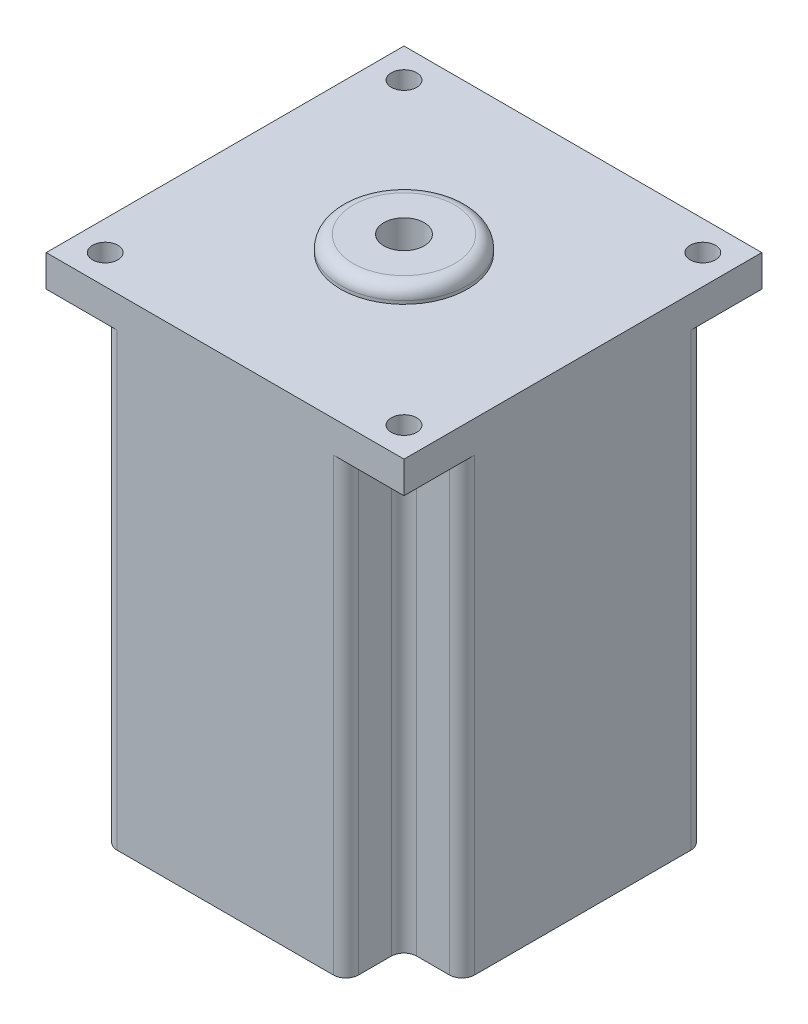
ISO-10303-21;
HEADER;
FILE_DESCRIPTION(('STEP AP214'),'2;1');
FILE_NAME('part.step','',(''),(''),'','','');
FILE_SCHEMA(('AUTOMOTIVE_DESIGN { 1 0 10303 214 1 1 1 1 }'));
ENDSEC;
DATA;
#1=APPLICATION_CONTEXT('core data for automotive mechanical design processes');
#2=APPLICATION_PROTOCOL_DEFINITION('international standard','automotive_design',2000,#1);
#3=PRODUCT_CONTEXT('',#1,'mechanical');
#4=PRODUCT('Part','Part','',(#3));
#5=PRODUCT_RELATED_PRODUCT_CATEGORY('part','',(#4));
#6=PRODUCT_DEFINITION_FORMATION('','',#4);
#7=PRODUCT_DEFINITION_CONTEXT('part definition',#1,'design');
#8=PRODUCT_DEFINITION('design','',#6,#7);
#9=PRODUCT_DEFINITION_SHAPE('','',#8);
#10=(LENGTH_UNIT() NAMED_UNIT(*) SI_UNIT(.MILLI.,.METRE.));
#11=(NAMED_UNIT(*) PLANE_ANGLE_UNIT() SI_UNIT($,.RADIAN.));
#12=(NAMED_UNIT(*) SI_UNIT($,.STERADIAN.) SOLID_ANGLE_UNIT());
#13=UNCERTAINTY_MEASURE_WITH_UNIT(LENGTH_MEASURE(1.E-05),#10,'distance_accuracy_value','');
#14=(GEOMETRIC_REPRESENTATION_CONTEXT(3) GLOBAL_UNCERTAINTY_ASSIGNED_CONTEXT((#13)) GLOBAL_UNIT_ASSIGNED_CONTEXT((#10,
#11,#12)) REPRESENTATION_CONTEXT('',''));
#15=CARTESIAN_POINT('',(0.,0.,0.));
#16=DIRECTION('',(0.,0.,1.));
#17=DIRECTION('',(1.,0.,0.));
#18=AXIS2_PLACEMENT_3D('',#15,#16,#17);
#19=CARTESIAN_POINT('',(0.,76.,0.));
#20=DIRECTION('',(0.,1.,0.));
#21=DIRECTION('',(0.,0.,1.));
#22=AXIS2_PLACEMENT_3D('',#19,#20,#21);
#23=PLANE('',#22);
#24=DIRECTION('',(0.,0.,-1.));
#25=VECTOR('',#24,1.);
#26=CARTESIAN_POINT('',(28.2,76.,-28.2));
#27=LINE('',#26,#25);
#28=CARTESIAN_POINT('',(28.2,76.,28.2));
#29=VERTEX_POINT('',#28);
#30=CARTESIAN_POINT('',(28.2,76.,-28.2));
#31=VERTEX_POINT('',#30);
#32=EDGE_CURVE('E367',#29,#31,#27,.T.);
#33=ORIENTED_EDGE('',*,*,#32,.T.);
#34=DIRECTION('',(-1.,0.,0.));
#35=VECTOR('',#34,1.);
#36=CARTESIAN_POINT('',(-28.2,76.,-28.2));
#37=LINE('',#36,#35);
#38=CARTESIAN_POINT('',(-28.2,76.,-28.2));
#39=VERTEX_POINT('',#38);
#40=EDGE_CURVE('E370',#31,#39,#37,.T.);
#41=ORIENTED_EDGE('',*,*,#40,.T.);
#42=DIRECTION('',(0.,0.,1.));
#43=VECTOR('',#42,1.);
#44=CARTESIAN_POINT('',(-28.2,76.,-28.2));
#45=LINE('',#44,#43);
#46=CARTESIAN_POINT('',(-28.2,76.,28.2));
#47=VERTEX_POINT('',#46);
#48=EDGE_CURVE('E373',#39,#47,#45,.T.);
#49=ORIENTED_EDGE('',*,*,#48,.T.);
#50=DIRECTION('',(1.,0.,0.));
#51=VECTOR('',#50,1.);
#52=CARTESIAN_POINT('',(-28.2,76.,28.2));
#53=LINE('',#52,#51);
#54=EDGE_CURVE('E375',#47,#29,#53,.T.);
#55=ORIENTED_EDGE('',*,*,#54,.T.);
#56=EDGE_LOOP('',(#33,#41,#49,#55));
#57=FACE_BOUND('',#56,.T.);
#58=CARTESIAN_POINT('',(-23.55,76.,-23.55));
#59=DIRECTION('',(0.,1.,0.));
#60=DIRECTION('',(0.,0.,1.));
#61=AXIS2_PLACEMENT_3D('',#58,#59,#60);
#62=CIRCLE('',#61,2.);
#63=CARTESIAN_POINT('',(-23.55,76.,-21.55));
#64=VERTEX_POINT('',#63);
#65=EDGE_CURVE('E355',#64,#64,#62,.T.);
#66=ORIENTED_EDGE('',*,*,#65,.F.);
#67=EDGE_LOOP('',(#66));
#68=FACE_BOUND('',#67,.T.);
#69=CARTESIAN_POINT('',(23.55,76.,-23.55));
#70=DIRECTION('',(0.,1.,0.));
#71=DIRECTION('',(0.,0.,1.));
#72=AXIS2_PLACEMENT_3D('',#69,#70,#71);
#73=CIRCLE('',#72,2.);
#74=CARTESIAN_POINT('',(23.55,76.,-21.55));
#75=VERTEX_POINT('',#74);
#76=EDGE_CURVE('E352',#75,#75,#73,.T.);
#77=ORIENTED_EDGE('',*,*,#76,.F.);
#78=EDGE_LOOP('',(#77));
#79=FACE_BOUND('',#78,.T.);
#80=CARTESIAN_POINT('',(-23.55,76.,23.55));
#81=DIRECTION('',(0.,1.,0.));
#82=DIRECTION('',(0.,0.,1.));
#83=AXIS2_PLACEMENT_3D('',#80,#81,#82);
#84=CIRCLE('',#83,2.);
#85=CARTESIAN_POINT('',(-23.55,76.,25.55));
#86=VERTEX_POINT('',#85);
#87=EDGE_CURVE('E359',#86,#86,#84,.T.);
#88=ORIENTED_EDGE('',*,*,#87,.F.);
#89=EDGE_LOOP('',(#88));
#90=FACE_BOUND('',#89,.T.);
#91=CARTESIAN_POINT('',(23.55,76.,23.55));
#92=DIRECTION('',(0.,1.,0.));
#93=DIRECTION('',(0.,0.,1.));
#94=AXIS2_PLACEMENT_3D('',#91,#92,#93);
#95=CIRCLE('',#94,2.);
#96=CARTESIAN_POINT('',(23.55,76.,25.55));
#97=VERTEX_POINT('',#96);
#98=EDGE_CURVE('E349',#97,#97,#95,.T.);
#99=ORIENTED_EDGE('',*,*,#98,.F.);
#100=EDGE_LOOP('',(#99));
#101=FACE_BOUND('',#100,.T.);
#102=CARTESIAN_POINT('',(0.,76.,0.));
#103=DIRECTION('',(0.,1.,0.));
#104=DIRECTION('',(0.,0.,1.));
#105=AXIS2_PLACEMENT_3D('',#102,#103,#104);
#106=CIRCLE('',#105,10.);
#107=CARTESIAN_POINT('',(0.,76.,10.));
#108=VERTEX_POINT('',#107);
#109=EDGE_CURVE('E315',#108,#108,#106,.T.);
#110=ORIENTED_EDGE('',*,*,#109,.F.);
#111=EDGE_LOOP('',(#110));
#112=FACE_BOUND('',#111,.T.);
#113=ADVANCED_FACE('F33',(#57,#68,#79,#90,#101,#112),#23,.T.);
#114=CARTESIAN_POINT('',(-28.2,76.,-28.2));
#115=DIRECTION('',(0.,0.,1.));
#116=DIRECTION('',(1.,0.,0.));
#117=AXIS2_PLACEMENT_3D('',#114,#115,#116);
#118=PLANE('',#117);
#119=DIRECTION('',(-1.,0.,0.));
#120=VECTOR('',#119,1.);
#121=CARTESIAN_POINT('',(-28.2,0.,-28.2));
#122=LINE('',#121,#120);
#123=CARTESIAN_POINT('',(17.05,0.,-28.2));
#124=VERTEX_POINT('',#123);
#125=CARTESIAN_POINT('',(-17.05,0.,-28.2));
#126=VERTEX_POINT('',#125);
#127=EDGE_CURVE('E380',#124,#126,#122,.T.);
#128=ORIENTED_EDGE('',*,*,#127,.T.);
#129=DIRECTION('',(0.,-1.,0.));
#130=VECTOR('',#129,1.);
#131=CARTESIAN_POINT('',(-17.05,71.,-28.2));
#132=LINE('',#131,#130);
#133=CARTESIAN_POINT('',(-17.05,71.,-28.2));
#134=VERTEX_POINT('',#133);
#135=EDGE_CURVE('E429',#126,#134,#132,.F.);
#136=ORIENTED_EDGE('',*,*,#135,.T.);
#137=DIRECTION('',(1.,0.,0.));
#138=VECTOR('',#137,1.);
#139=CARTESIAN_POINT('',(0.,71.,-28.2));
#140=LINE('',#139,#138);
#141=CARTESIAN_POINT('',(-28.2,71.,-28.2));
#142=VERTEX_POINT('',#141);
#143=EDGE_CURVE('E308',#142,#134,#140,.T.);
#144=ORIENTED_EDGE('',*,*,#143,.F.);
#145=DIRECTION('',(0.,-1.,0.));
#146=VECTOR('',#145,1.);
#147=CARTESIAN_POINT('',(-28.2,76.,-28.2));
#148=LINE('',#147,#146);
#149=EDGE_CURVE('E393',#39,#142,#148,.T.);
#150=ORIENTED_EDGE('',*,*,#149,.F.);
#151=ORIENTED_EDGE('',*,*,#40,.F.);
#152=DIRECTION('',(0.,-1.,0.));
#153=VECTOR('',#152,1.);
#154=CARTESIAN_POINT('',(28.2,76.,-28.2));
#155=LINE('',#154,#153);
#156=CARTESIAN_POINT('',(28.2,71.,-28.2));
#157=VERTEX_POINT('',#156);
#158=EDGE_CURVE('E396',#31,#157,#155,.T.);
#159=ORIENTED_EDGE('',*,*,#158,.T.);
#160=DIRECTION('',(1.,0.,0.));
#161=VECTOR('',#160,1.);
#162=CARTESIAN_POINT('',(0.,71.,-28.2));
#163=LINE('',#162,#161);
#164=CARTESIAN_POINT('',(17.05,71.,-28.2));
#165=VERTEX_POINT('',#164);
#166=EDGE_CURVE('E273',#165,#157,#163,.T.);
#167=ORIENTED_EDGE('',*,*,#166,.F.);
#168=DIRECTION('',(0.,-1.,0.));
#169=VECTOR('',#168,1.);
#170=CARTESIAN_POINT('',(17.05,76.,-28.2));
#171=LINE('',#170,#169);
#172=EDGE_CURVE('E426',#165,#124,#171,.T.);
#173=ORIENTED_EDGE('',*,*,#172,.T.);
#174=EDGE_LOOP('',(#128,#136,#144,#150,#151,#159,#167,#173));
#175=FACE_BOUND('',#174,.T.);
#176=ADVANCED_FACE('F490',(#175),#118,.F.);
#177=CARTESIAN_POINT('',(-28.2,76.,-28.2));
#178=DIRECTION('',(1.,0.,0.));
#179=DIRECTION('',(0.,0.,-1.));
#180=AXIS2_PLACEMENT_3D('',#177,#178,#179);
#181=PLANE('',#180);
#182=DIRECTION('',(0.,0.,-1.));
#183=VECTOR('',#182,1.);
#184=CARTESIAN_POINT('',(-28.2,71.,0.));
#185=LINE('',#184,#183);
#186=CARTESIAN_POINT('',(-28.2,71.,-17.05));
#187=VERTEX_POINT('',#186);
#188=EDGE_CURVE('E306',#187,#142,#185,.T.);
#189=ORIENTED_EDGE('',*,*,#188,.F.);
#190=DIRECTION('',(0.,-1.,0.));
#191=VECTOR('',#190,1.);
#192=CARTESIAN_POINT('',(-28.2,0.,-17.05));
#193=LINE('',#192,#191);
#194=CARTESIAN_POINT('',(-28.2,0.,-17.05));
#195=VERTEX_POINT('',#194);
#196=EDGE_CURVE('E402',#187,#195,#193,.T.);
#197=ORIENTED_EDGE('',*,*,#196,.T.);
#198=DIRECTION('',(0.,0.,1.));
#199=VECTOR('',#198,1.);
#200=CARTESIAN_POINT('',(-28.2,0.,-28.2));
#201=LINE('',#200,#199);
#202=CARTESIAN_POINT('',(-28.2,0.,17.05));
#203=VERTEX_POINT('',#202);
#204=EDGE_CURVE('E383',#195,#203,#201,.T.);
#205=ORIENTED_EDGE('',*,*,#204,.T.);
#206=DIRECTION('',(0.,-1.,0.));
#207=VECTOR('',#206,1.);
#208=CARTESIAN_POINT('',(-28.2,71.,17.05));
#209=LINE('',#208,#207);
#210=CARTESIAN_POINT('',(-28.2,71.,17.05));
#211=VERTEX_POINT('',#210);
#212=EDGE_CURVE('E399',#203,#211,#209,.F.);
#213=ORIENTED_EDGE('',*,*,#212,.T.);
#214=DIRECTION('',(0.,0.,-1.));
#215=VECTOR('',#214,1.);
#216=CARTESIAN_POINT('',(-28.2,71.,0.));
#217=LINE('',#216,#215);
#218=CARTESIAN_POINT('',(-28.2,71.,28.2));
#219=VERTEX_POINT('',#218);
#220=EDGE_CURVE('E331',#219,#211,#217,.T.);
#221=ORIENTED_EDGE('',*,*,#220,.F.);
#222=DIRECTION('',(0.,-1.,0.));
#223=VECTOR('',#222,1.);
#224=CARTESIAN_POINT('',(-28.2,76.,28.2));
#225=LINE('',#224,#223);
#226=EDGE_CURVE('E390',#47,#219,#225,.T.);
#227=ORIENTED_EDGE('',*,*,#226,.F.);
#228=ORIENTED_EDGE('',*,*,#48,.F.);
#229=ORIENTED_EDGE('',*,*,#149,.T.);
#230=EDGE_LOOP('',(#189,#197,#205,#213,#221,#227,#228,#229));
#231=FACE_BOUND('',#230,.T.);
#232=ADVANCED_FACE('F496',(#231),#181,.F.);
#233=CARTESIAN_POINT('',(-28.2,76.,28.2));
#234=DIRECTION('',(0.,0.,-1.));
#235=DIRECTION('',(-1.,0.,0.));
#236=AXIS2_PLACEMENT_3D('',#233,#234,#235);
#237=PLANE('',#236);
#238=DIRECTION('',(-1.,0.,0.));
#239=VECTOR('',#238,1.);
#240=CARTESIAN_POINT('',(0.,71.,28.2));
#241=LINE('',#240,#239);
#242=CARTESIAN_POINT('',(-17.05,71.,28.2));
#243=VERTEX_POINT('',#242);
#244=EDGE_CURVE('E329',#243,#219,#241,.T.);
#245=ORIENTED_EDGE('',*,*,#244,.F.);
#246=DIRECTION('',(0.,-1.,0.));
#247=VECTOR('',#246,1.);
#248=CARTESIAN_POINT('',(-17.05,0.,28.2));
#249=LINE('',#248,#247);
#250=CARTESIAN_POINT('',(-17.05,0.,28.2));
#251=VERTEX_POINT('',#250);
#252=EDGE_CURVE('E438',#243,#251,#249,.T.);
#253=ORIENTED_EDGE('',*,*,#252,.T.);
#254=DIRECTION('',(1.,0.,0.));
#255=VECTOR('',#254,1.);
#256=CARTESIAN_POINT('',(-28.2,0.,28.2));
#257=LINE('',#256,#255);
#258=CARTESIAN_POINT('',(17.05,0.,28.2));
#259=VERTEX_POINT('',#258);
#260=EDGE_CURVE('E371',#251,#259,#257,.T.);
#261=ORIENTED_EDGE('',*,*,#260,.T.);
#262=DIRECTION('',(0.,-1.,0.));
#263=VECTOR('',#262,1.);
#264=CARTESIAN_POINT('',(17.05,71.,28.2));
#265=LINE('',#264,#263);
#266=CARTESIAN_POINT('',(17.05,71.,28.2));
#267=VERTEX_POINT('',#266);
#268=EDGE_CURVE('E435',#259,#267,#265,.F.);
#269=ORIENTED_EDGE('',*,*,#268,.T.);
#270=DIRECTION('',(-1.,0.,0.));
#271=VECTOR('',#270,1.);
#272=CARTESIAN_POINT('',(0.,71.,28.2));
#273=LINE('',#272,#271);
#274=CARTESIAN_POINT('',(28.2,71.,28.2));
#275=VERTEX_POINT('',#274);
#276=EDGE_CURVE('E251',#275,#267,#273,.T.);
#277=ORIENTED_EDGE('',*,*,#276,.F.);
#278=DIRECTION('',(0.,-1.,0.));
#279=VECTOR('',#278,1.);
#280=CARTESIAN_POINT('',(28.2,76.,28.2));
#281=LINE('',#280,#279);
#282=EDGE_CURVE('E377',#29,#275,#281,.T.);
#283=ORIENTED_EDGE('',*,*,#282,.F.);
#284=ORIENTED_EDGE('',*,*,#54,.F.);
#285=ORIENTED_EDGE('',*,*,#226,.T.);
#286=EDGE_LOOP('',(#245,#253,#261,#269,#277,#283,#284,#285));
#287=FACE_BOUND('',#286,.T.);
#288=ADVANCED_FACE('F507',(#287),#237,.F.);
#289=CARTESIAN_POINT('',(0.,0.,0.));
#290=DIRECTION('',(0.,1.,0.));
#291=DIRECTION('',(0.,0.,1.));
#292=AXIS2_PLACEMENT_3D('',#289,#290,#291);
#293=PLANE('',#292);
#294=CARTESIAN_POINT('',(0.,0.,0.));
#295=DIRECTION('',(0.,1.,0.));
#296=DIRECTION('',(0.,0.,1.));
#297=AXIS2_PLACEMENT_3D('',#294,#295,#296);
#298=CIRCLE('',#297,3.175);
#299=CARTESIAN_POINT('',(0.,0.,3.175));
#300=VERTEX_POINT('',#299);
#301=EDGE_CURVE('E356',#300,#300,#298,.T.);
#302=ORIENTED_EDGE('',*,*,#301,.T.);
#303=EDGE_LOOP('',(#302));
#304=FACE_BOUND('',#303,.T.);
#305=ORIENTED_EDGE('',*,*,#204,.F.);
#306=CARTESIAN_POINT('',(-26.2,0.,-17.05));
#307=DIRECTION('',(0.,1.,0.));
#308=DIRECTION('',(0.,0.,1.));
#309=AXIS2_PLACEMENT_3D('',#306,#307,#308);
#310=CIRCLE('',#309,2.);
#311=CARTESIAN_POINT('',(-26.2,0.,-19.05));
#312=VERTEX_POINT('',#311);
#313=EDGE_CURVE('E419',#195,#312,#310,.F.);
#314=ORIENTED_EDGE('',*,*,#313,.T.);
#315=DIRECTION('',(1.,0.,0.));
#316=VECTOR('',#315,1.);
#317=CARTESIAN_POINT('',(0.,0.,-19.05));
#318=LINE('',#317,#316);
#319=CARTESIAN_POINT('',(-21.05,0.,-19.05));
#320=VERTEX_POINT('',#319);
#321=EDGE_CURVE('E298',#312,#320,#318,.T.);
#322=ORIENTED_EDGE('',*,*,#321,.T.);
#323=CARTESIAN_POINT('',(-21.05,0.,-21.05));
#324=DIRECTION('',(0.,-1.,0.));
#325=DIRECTION('',(0.,0.,-1.));
#326=AXIS2_PLACEMENT_3D('',#323,#324,#325);
#327=CIRCLE('',#326,2.);
#328=CARTESIAN_POINT('',(-19.05,0.,-21.05));
#329=VERTEX_POINT('',#328);
#330=EDGE_CURVE('E314',#329,#320,#327,.T.);
#331=ORIENTED_EDGE('',*,*,#330,.F.);
#332=DIRECTION('',(0.,0.,-1.));
#333=VECTOR('',#332,1.);
#334=CARTESIAN_POINT('',(-19.05,0.,0.));
#335=LINE('',#334,#333);
#336=CARTESIAN_POINT('',(-19.05,0.,-26.2));
#337=VERTEX_POINT('',#336);
#338=EDGE_CURVE('E311',#329,#337,#335,.T.);
#339=ORIENTED_EDGE('',*,*,#338,.T.);
#340=CARTESIAN_POINT('',(-17.05,0.,-26.2));
#341=DIRECTION('',(0.,1.,0.));
#342=DIRECTION('',(0.,0.,1.));
#343=AXIS2_PLACEMENT_3D('',#340,#341,#342);
#344=CIRCLE('',#343,2.);
#345=EDGE_CURVE('E417',#337,#126,#344,.F.);
#346=ORIENTED_EDGE('',*,*,#345,.T.);
#347=ORIENTED_EDGE('',*,*,#127,.F.);
#348=CARTESIAN_POINT('',(17.05,0.,-26.2));
#349=DIRECTION('',(0.,1.,0.));
#350=DIRECTION('',(0.,0.,1.));
#351=AXIS2_PLACEMENT_3D('',#348,#349,#350);
#352=CIRCLE('',#351,2.);
#353=CARTESIAN_POINT('',(19.05,0.,-26.2));
#354=VERTEX_POINT('',#353);
#355=EDGE_CURVE('E407',#124,#354,#352,.F.);
#356=ORIENTED_EDGE('',*,*,#355,.T.);
#357=DIRECTION('',(0.,0.,-1.));
#358=VECTOR('',#357,1.);
#359=CARTESIAN_POINT('',(19.05,0.,0.));
#360=LINE('',#359,#358);
#361=CARTESIAN_POINT('',(19.05,0.,-21.05));
#362=VERTEX_POINT('',#361);
#363=EDGE_CURVE('E286',#362,#354,#360,.T.);
#364=ORIENTED_EDGE('',*,*,#363,.F.);
#365=CARTESIAN_POINT('',(21.05,0.,-21.05));
#366=DIRECTION('',(0.,-1.,0.));
#367=DIRECTION('',(0.,0.,-1.));
#368=AXIS2_PLACEMENT_3D('',#365,#366,#367);
#369=CIRCLE('',#368,2.);
#370=CARTESIAN_POINT('',(21.05,0.,-19.05));
#371=VERTEX_POINT('',#370);
#372=EDGE_CURVE('E283',#362,#371,#369,.F.);
#373=ORIENTED_EDGE('',*,*,#372,.T.);
#374=DIRECTION('',(-1.,0.,0.));
#375=VECTOR('',#374,1.);
#376=CARTESIAN_POINT('',(0.,0.,-19.05));
#377=LINE('',#376,#375);
#378=CARTESIAN_POINT('',(26.2,0.,-19.05));
#379=VERTEX_POINT('',#378);
#380=EDGE_CURVE('E271',#379,#371,#377,.T.);
#381=ORIENTED_EDGE('',*,*,#380,.F.);
#382=CARTESIAN_POINT('',(26.2,0.,-17.05));
#383=DIRECTION('',(0.,1.,0.));
#384=DIRECTION('',(0.,0.,1.));
#385=AXIS2_PLACEMENT_3D('',#382,#383,#384);
#386=CIRCLE('',#385,2.);
#387=CARTESIAN_POINT('',(28.2,0.,-17.05));
#388=VERTEX_POINT('',#387);
#389=EDGE_CURVE('E405',#379,#388,#386,.F.);
#390=ORIENTED_EDGE('',*,*,#389,.T.);
#391=DIRECTION('',(0.,0.,-1.));
#392=VECTOR('',#391,1.);
#393=CARTESIAN_POINT('',(28.2,0.,-28.2));
#394=LINE('',#393,#392);
#395=CARTESIAN_POINT('',(28.2,0.,17.05));
#396=VERTEX_POINT('',#395);
#397=EDGE_CURVE('E366',#396,#388,#394,.T.);
#398=ORIENTED_EDGE('',*,*,#397,.F.);
#399=CARTESIAN_POINT('',(26.2,0.,17.05));
#400=DIRECTION('',(0.,1.,0.));
#401=DIRECTION('',(0.,0.,1.));
#402=AXIS2_PLACEMENT_3D('',#399,#400,#401);
#403=CIRCLE('',#402,2.);
#404=CARTESIAN_POINT('',(26.2,0.,19.05));
#405=VERTEX_POINT('',#404);
#406=EDGE_CURVE('E409',#396,#405,#403,.F.);
#407=ORIENTED_EDGE('',*,*,#406,.T.);
#408=DIRECTION('',(1.,0.,0.));
#409=VECTOR('',#408,1.);
#410=CARTESIAN_POINT('',(0.,0.,19.05));
#411=LINE('',#410,#409);
#412=CARTESIAN_POINT('',(21.05,0.,19.05));
#413=VERTEX_POINT('',#412);
#414=EDGE_CURVE('E260',#413,#405,#411,.T.);
#415=ORIENTED_EDGE('',*,*,#414,.F.);
#416=CARTESIAN_POINT('',(21.05,0.,21.05));
#417=DIRECTION('',(0.,-1.,0.));
#418=DIRECTION('',(0.,0.,-1.));
#419=AXIS2_PLACEMENT_3D('',#416,#417,#418);
#420=CIRCLE('',#419,2.);
#421=CARTESIAN_POINT('',(19.05,0.,21.05));
#422=VERTEX_POINT('',#421);
#423=EDGE_CURVE('E227',#413,#422,#420,.F.);
#424=ORIENTED_EDGE('',*,*,#423,.T.);
#425=DIRECTION('',(0.,0.,1.));
#426=VECTOR('',#425,1.);
#427=CARTESIAN_POINT('',(19.05,0.,0.));
#428=LINE('',#427,#426);
#429=CARTESIAN_POINT('',(19.05,0.,26.2));
#430=VERTEX_POINT('',#429);
#431=EDGE_CURVE('E244',#422,#430,#428,.T.);
#432=ORIENTED_EDGE('',*,*,#431,.T.);
#433=CARTESIAN_POINT('',(17.05,0.,26.2));
#434=DIRECTION('',(0.,1.,0.));
#435=DIRECTION('',(0.,0.,1.));
#436=AXIS2_PLACEMENT_3D('',#433,#434,#435);
#437=CIRCLE('',#436,2.);
#438=EDGE_CURVE('E411',#430,#259,#437,.F.);
#439=ORIENTED_EDGE('',*,*,#438,.T.);
#440=ORIENTED_EDGE('',*,*,#260,.F.);
#441=CARTESIAN_POINT('',(-17.05,0.,26.2));
#442=DIRECTION('',(0.,1.,0.));
#443=DIRECTION('',(0.,0.,1.));
#444=AXIS2_PLACEMENT_3D('',#441,#442,#443);
#445=CIRCLE('',#444,2.);
#446=CARTESIAN_POINT('',(-19.05,0.,26.2));
#447=VERTEX_POINT('',#446);
#448=EDGE_CURVE('E413',#251,#447,#445,.F.);
#449=ORIENTED_EDGE('',*,*,#448,.T.);
#450=DIRECTION('',(0.,0.,-1.));
#451=VECTOR('',#450,1.);
#452=CARTESIAN_POINT('',(-19.05,0.,0.));
#453=LINE('',#452,#451);
#454=CARTESIAN_POINT('',(-19.05,0.,21.05));
#455=VERTEX_POINT('',#454);
#456=EDGE_CURVE('E342',#447,#455,#453,.T.);
#457=ORIENTED_EDGE('',*,*,#456,.T.);
#458=CARTESIAN_POINT('',(-21.05,0.,21.05));
#459=DIRECTION('',(0.,-1.,0.));
#460=DIRECTION('',(0.,0.,-1.));
#461=AXIS2_PLACEMENT_3D('',#458,#459,#460);
#462=CIRCLE('',#461,2.);
#463=CARTESIAN_POINT('',(-21.05,0.,19.05));
#464=VERTEX_POINT('',#463);
#465=EDGE_CURVE('E265',#455,#464,#462,.F.);
#466=ORIENTED_EDGE('',*,*,#465,.T.);
#467=DIRECTION('',(-1.,0.,0.));
#468=VECTOR('',#467,1.);
#469=CARTESIAN_POINT('',(0.,0.,19.05));
#470=LINE('',#469,#468);
#471=CARTESIAN_POINT('',(-26.2,0.,19.05));
#472=VERTEX_POINT('',#471);
#473=EDGE_CURVE('E327',#464,#472,#470,.T.);
#474=ORIENTED_EDGE('',*,*,#473,.T.);
#475=CARTESIAN_POINT('',(-26.2,0.,17.05));
#476=DIRECTION('',(0.,1.,0.));
#477=DIRECTION('',(0.,0.,1.));
#478=AXIS2_PLACEMENT_3D('',#475,#476,#477);
#479=CIRCLE('',#478,2.);
#480=EDGE_CURVE('E415',#472,#203,#479,.F.);
#481=ORIENTED_EDGE('',*,*,#480,.T.);
#482=EDGE_LOOP('',(#305,#314,#322,#331,#339,#346,#347,#356,#364,#373,#381,#390,#398,#407,#415,
#424,#432,#439,#440,#449,#457,#466,#474,#481));
#483=FACE_BOUND('',#482,.T.);
#484=ADVANCED_FACE('F504',(#304,#483),#293,.F.);
#485=CARTESIAN_POINT('',(-23.55,0.,-23.55));
#486=DIRECTION('',(0.,1.,0.));
#487=DIRECTION('',(0.,0.,1.));
#488=AXIS2_PLACEMENT_3D('',#485,#486,#487);
#489=CYLINDRICAL_SURFACE('',#488,2.);
#490=ORIENTED_EDGE('',*,*,#65,.T.);
#491=EDGE_LOOP('',(#490));
#492=FACE_BOUND('',#491,.T.);
#493=CARTESIAN_POINT('',(-23.55,71.,-23.55));
#494=DIRECTION('',(0.,-1.,0.));
#495=DIRECTION('',(0.,0.,-1.));
#496=AXIS2_PLACEMENT_3D('',#493,#494,#495);
#497=CIRCLE('',#496,2.);
#498=CARTESIAN_POINT('',(-23.55,71.,-25.55));
#499=VERTEX_POINT('',#498);
#500=EDGE_CURVE('E294',#499,#499,#497,.F.);
#501=ORIENTED_EDGE('',*,*,#500,.F.);
#502=EDGE_LOOP('',(#501));
#503=FACE_BOUND('',#502,.T.);
#504=ADVANCED_FACE('F502',(#492,#503),#489,.F.);
#505=CARTESIAN_POINT('',(23.55,0.,-23.55));
#506=DIRECTION('',(0.,1.,0.));
#507=DIRECTION('',(0.,0.,1.));
#508=AXIS2_PLACEMENT_3D('',#505,#506,#507);
#509=CYLINDRICAL_SURFACE('',#508,2.);
#510=ORIENTED_EDGE('',*,*,#76,.T.);
#511=EDGE_LOOP('',(#510));
#512=FACE_BOUND('',#511,.T.);
#513=CARTESIAN_POINT('',(23.55,71.,-23.55));
#514=DIRECTION('',(0.,-1.,0.));
#515=DIRECTION('',(0.,0.,-1.));
#516=AXIS2_PLACEMENT_3D('',#513,#514,#515);
#517=CIRCLE('',#516,2.);
#518=CARTESIAN_POINT('',(23.55,71.,-25.55));
#519=VERTEX_POINT('',#518);
#520=EDGE_CURVE('E279',#519,#519,#517,.F.);
#521=ORIENTED_EDGE('',*,*,#520,.F.);
#522=EDGE_LOOP('',(#521));
#523=FACE_BOUND('',#522,.T.);
#524=ADVANCED_FACE('F668',(#512,#523),#509,.F.);
#525=CARTESIAN_POINT('',(-23.55,0.,23.55));
#526=DIRECTION('',(0.,1.,0.));
#527=DIRECTION('',(0.,0.,1.));
#528=AXIS2_PLACEMENT_3D('',#525,#526,#527);
#529=CYLINDRICAL_SURFACE('',#528,2.);
#530=ORIENTED_EDGE('',*,*,#87,.T.);
#531=EDGE_LOOP('',(#530));
#532=FACE_BOUND('',#531,.T.);
#533=CARTESIAN_POINT('',(-23.55,71.,23.55));
#534=DIRECTION('',(0.,-1.,0.));
#535=DIRECTION('',(0.,0.,-1.));
#536=AXIS2_PLACEMENT_3D('',#533,#534,#535);
#537=CIRCLE('',#536,2.);
#538=CARTESIAN_POINT('',(-23.55,71.,21.55));
#539=VERTEX_POINT('',#538);
#540=EDGE_CURVE('E336',#539,#539,#537,.F.);
#541=ORIENTED_EDGE('',*,*,#540,.F.);
#542=EDGE_LOOP('',(#541));
#543=FACE_BOUND('',#542,.T.);
#544=ADVANCED_FACE('F671',(#532,#543),#529,.F.);
#545=CARTESIAN_POINT('',(23.55,0.,23.55));
#546=DIRECTION('',(0.,1.,0.));
#547=DIRECTION('',(0.,0.,1.));
#548=AXIS2_PLACEMENT_3D('',#545,#546,#547);
#549=CYLINDRICAL_SURFACE('',#548,2.);
#550=ORIENTED_EDGE('',*,*,#98,.T.);
#551=EDGE_LOOP('',(#550));
#552=FACE_BOUND('',#551,.T.);
#553=CARTESIAN_POINT('',(23.55,71.,23.55));
#554=DIRECTION('',(0.,-1.,0.));
#555=DIRECTION('',(0.,0.,-1.));
#556=AXIS2_PLACEMENT_3D('',#553,#554,#555);
#557=CIRCLE('',#556,2.);
#558=CARTESIAN_POINT('',(23.55,71.,21.55));
#559=VERTEX_POINT('',#558);
#560=EDGE_CURVE('E233',#559,#559,#557,.F.);
#561=ORIENTED_EDGE('',*,*,#560,.F.);
#562=EDGE_LOOP('',(#561));
#563=FACE_BOUND('',#562,.T.);
#564=ADVANCED_FACE('F519',(#552,#563),#549,.F.);
#565=CARTESIAN_POINT('',(28.2,76.,-28.2));
#566=DIRECTION('',(-1.,0.,0.));
#567=DIRECTION('',(0.,0.,1.));
#568=AXIS2_PLACEMENT_3D('',#565,#566,#567);
#569=PLANE('',#568);
#570=DIRECTION('',(0.,0.,1.));
#571=VECTOR('',#570,1.);
#572=CARTESIAN_POINT('',(28.2,71.,0.));
#573=LINE('',#572,#571);
#574=CARTESIAN_POINT('',(28.2,71.,17.05));
#575=VERTEX_POINT('',#574);
#576=EDGE_CURVE('E249',#575,#275,#573,.T.);
#577=ORIENTED_EDGE('',*,*,#576,.F.);
#578=DIRECTION('',(0.,-1.,0.));
#579=VECTOR('',#578,1.);
#580=CARTESIAN_POINT('',(28.2,76.,17.05));
#581=LINE('',#580,#579);
#582=EDGE_CURVE('E449',#575,#396,#581,.T.);
#583=ORIENTED_EDGE('',*,*,#582,.T.);
#584=ORIENTED_EDGE('',*,*,#397,.T.);
#585=DIRECTION('',(0.,-1.,0.));
#586=VECTOR('',#585,1.);
#587=CARTESIAN_POINT('',(28.2,76.,-17.05));
#588=LINE('',#587,#586);
#589=CARTESIAN_POINT('',(28.2,71.,-17.05));
#590=VERTEX_POINT('',#589);
#591=EDGE_CURVE('E446',#388,#590,#588,.F.);
#592=ORIENTED_EDGE('',*,*,#591,.T.);
#593=DIRECTION('',(0.,0.,1.));
#594=VECTOR('',#593,1.);
#595=CARTESIAN_POINT('',(28.2,71.,0.));
#596=LINE('',#595,#594);
#597=EDGE_CURVE('E275',#157,#590,#596,.T.);
#598=ORIENTED_EDGE('',*,*,#597,.F.);
#599=ORIENTED_EDGE('',*,*,#158,.F.);
#600=ORIENTED_EDGE('',*,*,#32,.F.);
#601=ORIENTED_EDGE('',*,*,#282,.T.);
#602=EDGE_LOOP('',(#577,#583,#584,#592,#598,#599,#600,#601));
#603=FACE_BOUND('',#602,.T.);
#604=ADVANCED_FACE('F515',(#603),#569,.F.);
#605=CARTESIAN_POINT('',(0.,0.,0.));
#606=DIRECTION('',(0.,1.,0.));
#607=DIRECTION('',(0.,0.,1.));
#608=AXIS2_PLACEMENT_3D('',#605,#606,#607);
#609=CYLINDRICAL_SURFACE('',#608,3.175);
#610=ORIENTED_EDGE('',*,*,#301,.F.);
#611=EDGE_LOOP('',(#610));
#612=FACE_BOUND('',#611,.T.);
#613=CARTESIAN_POINT('',(0.,78.5,0.));
#614=DIRECTION('',(0.,1.,0.));
#615=DIRECTION('',(0.,0.,1.));
#616=AXIS2_PLACEMENT_3D('',#613,#614,#615);
#617=CIRCLE('',#616,3.175);
#618=CARTESIAN_POINT('',(0.,78.5,3.175));
#619=VERTEX_POINT('',#618);
#620=EDGE_CURVE('E927',#619,#619,#617,.T.);
#621=ORIENTED_EDGE('',*,*,#620,.T.);
#622=EDGE_LOOP('',(#621));
#623=FACE_BOUND('',#622,.T.);
#624=ADVANCED_FACE('F518',(#612,#623),#609,.F.);
#625=CARTESIAN_POINT('',(21.05,71.,21.05));
#626=DIRECTION('',(0.,-1.,0.));
#627=DIRECTION('',(0.,0.,-1.));
#628=AXIS2_PLACEMENT_3D('',#625,#626,#627);
#629=CYLINDRICAL_SURFACE('',#628,2.);
#630=ORIENTED_EDGE('',*,*,#423,.F.);
#631=DIRECTION('',(0.,-1.,0.));
#632=VECTOR('',#631,1.);
#633=CARTESIAN_POINT('',(21.05,71.,19.05));
#634=LINE('',#633,#632);
#635=CARTESIAN_POINT('',(21.05,71.,19.05));
#636=VERTEX_POINT('',#635);
#637=EDGE_CURVE('E220',#636,#413,#634,.T.);
#638=ORIENTED_EDGE('',*,*,#637,.F.);
#639=CARTESIAN_POINT('',(21.05,71.,21.05));
#640=DIRECTION('',(0.,-1.,0.));
#641=DIRECTION('',(0.,0.,-1.));
#642=AXIS2_PLACEMENT_3D('',#639,#640,#641);
#643=CIRCLE('',#642,2.);
#644=CARTESIAN_POINT('',(19.05,71.,21.05));
#645=VERTEX_POINT('',#644);
#646=EDGE_CURVE('E224',#636,#645,#643,.F.);
#647=ORIENTED_EDGE('',*,*,#646,.T.);
#648=DIRECTION('',(0.,-1.,0.));
#649=VECTOR('',#648,1.);
#650=CARTESIAN_POINT('',(19.05,71.,21.05));
#651=LINE('',#650,#649);
#652=EDGE_CURVE('E232',#645,#422,#651,.T.);
#653=ORIENTED_EDGE('',*,*,#652,.T.);
#654=EDGE_LOOP('',(#630,#638,#647,#653));
#655=FACE_BOUND('',#654,.T.);
#656=ADVANCED_FACE('F222',(#655),#629,.F.);
#657=CARTESIAN_POINT('',(19.05,71.,0.));
#658=DIRECTION('',(1.,0.,0.));
#659=DIRECTION('',(0.,0.,-1.));
#660=AXIS2_PLACEMENT_3D('',#657,#658,#659);
#661=PLANE('',#660);
#662=DIRECTION('',(0.,0.,1.));
#663=VECTOR('',#662,1.);
#664=CARTESIAN_POINT('',(19.05,71.,0.));
#665=LINE('',#664,#663);
#666=CARTESIAN_POINT('',(19.05,71.,26.2));
#667=VERTEX_POINT('',#666);
#668=EDGE_CURVE('E243',#645,#667,#665,.T.);
#669=ORIENTED_EDGE('',*,*,#668,.T.);
#670=DIRECTION('',(0.,-1.,0.));
#671=VECTOR('',#670,1.);
#672=CARTESIAN_POINT('',(19.05,0.,26.2));
#673=LINE('',#672,#671);
#674=EDGE_CURVE('E443',#667,#430,#673,.T.);
#675=ORIENTED_EDGE('',*,*,#674,.T.);
#676=ORIENTED_EDGE('',*,*,#431,.F.);
#677=ORIENTED_EDGE('',*,*,#652,.F.);
#678=EDGE_LOOP('',(#669,#675,#676,#677));
#679=FACE_BOUND('',#678,.T.);
#680=ADVANCED_FACE('F620',(#679),#661,.T.);
#681=CARTESIAN_POINT('',(0.,71.,19.05));
#682=DIRECTION('',(0.,0.,-1.));
#683=DIRECTION('',(-1.,0.,0.));
#684=AXIS2_PLACEMENT_3D('',#681,#682,#683);
#685=PLANE('',#684);
#686=ORIENTED_EDGE('',*,*,#414,.T.);
#687=DIRECTION('',(0.,-1.,0.));
#688=VECTOR('',#687,1.);
#689=CARTESIAN_POINT('',(26.2,71.,19.05));
#690=LINE('',#689,#688);
#691=CARTESIAN_POINT('',(26.2,71.,19.05));
#692=VERTEX_POINT('',#691);
#693=EDGE_CURVE('E248',#405,#692,#690,.F.);
#694=ORIENTED_EDGE('',*,*,#693,.T.);
#695=DIRECTION('',(1.,0.,0.));
#696=VECTOR('',#695,1.);
#697=CARTESIAN_POINT('',(0.,71.,19.05));
#698=LINE('',#697,#696);
#699=EDGE_CURVE('E240',#636,#692,#698,.T.);
#700=ORIENTED_EDGE('',*,*,#699,.F.);
#701=ORIENTED_EDGE('',*,*,#637,.T.);
#702=EDGE_LOOP('',(#686,#694,#700,#701));
#703=FACE_BOUND('',#702,.T.);
#704=ADVANCED_FACE('F246',(#703),#685,.F.);
#705=CARTESIAN_POINT('',(0.,71.,0.));
#706=DIRECTION('',(0.,-1.,0.));
#707=DIRECTION('',(0.,0.,-1.));
#708=AXIS2_PLACEMENT_3D('',#705,#706,#707);
#709=PLANE('',#708);
#710=ORIENTED_EDGE('',*,*,#646,.F.);
#711=ORIENTED_EDGE('',*,*,#699,.T.);
#712=CARTESIAN_POINT('',(26.2,71.,17.05));
#713=DIRECTION('',(0.,-1.,0.));
#714=DIRECTION('',(0.,0.,-1.));
#715=AXIS2_PLACEMENT_3D('',#712,#713,#714);
#716=CIRCLE('',#715,2.);
#717=EDGE_CURVE('E469',#692,#575,#716,.F.);
#718=ORIENTED_EDGE('',*,*,#717,.T.);
#719=ORIENTED_EDGE('',*,*,#576,.T.);
#720=ORIENTED_EDGE('',*,*,#276,.T.);
#721=CARTESIAN_POINT('',(17.05,71.,26.2));
#722=DIRECTION('',(0.,-1.,0.));
#723=DIRECTION('',(0.,0.,-1.));
#724=AXIS2_PLACEMENT_3D('',#721,#722,#723);
#725=CIRCLE('',#724,2.);
#726=EDGE_CURVE('E467',#267,#667,#725,.F.);
#727=ORIENTED_EDGE('',*,*,#726,.T.);
#728=ORIENTED_EDGE('',*,*,#668,.F.);
#729=EDGE_LOOP('',(#710,#711,#718,#719,#720,#727,#728));
#730=FACE_BOUND('',#729,.T.);
#731=ORIENTED_EDGE('',*,*,#560,.T.);
#732=EDGE_LOOP('',(#731));
#733=FACE_BOUND('',#732,.T.);
#734=ADVANCED_FACE('F237',(#730,#733),#709,.T.);
#735=CARTESIAN_POINT('',(-21.05,71.,21.05));
#736=DIRECTION('',(0.,-1.,0.));
#737=DIRECTION('',(0.,0.,-1.));
#738=AXIS2_PLACEMENT_3D('',#735,#736,#737);
#739=CYLINDRICAL_SURFACE('',#738,2.);
#740=ORIENTED_EDGE('',*,*,#465,.F.);
#741=DIRECTION('',(0.,-1.,0.));
#742=VECTOR('',#741,1.);
#743=CARTESIAN_POINT('',(-19.05,71.,21.05));
#744=LINE('',#743,#742);
#745=CARTESIAN_POINT('',(-19.05,71.,21.05));
#746=VERTEX_POINT('',#745);
#747=EDGE_CURVE('E339',#746,#455,#744,.T.);
#748=ORIENTED_EDGE('',*,*,#747,.F.);
#749=CARTESIAN_POINT('',(-21.05,71.,21.05));
#750=DIRECTION('',(0.,-1.,0.));
#751=DIRECTION('',(0.,0.,-1.));
#752=AXIS2_PLACEMENT_3D('',#749,#750,#751);
#753=CIRCLE('',#752,2.);
#754=CARTESIAN_POINT('',(-21.05,71.,19.05));
#755=VERTEX_POINT('',#754);
#756=EDGE_CURVE('E323',#746,#755,#753,.F.);
#757=ORIENTED_EDGE('',*,*,#756,.T.);
#758=DIRECTION('',(0.,-1.,0.));
#759=VECTOR('',#758,1.);
#760=CARTESIAN_POINT('',(-21.05,71.,19.05));
#761=LINE('',#760,#759);
#762=EDGE_CURVE('E346',#755,#464,#761,.T.);
#763=ORIENTED_EDGE('',*,*,#762,.T.);
#764=EDGE_LOOP('',(#740,#748,#757,#763));
#765=FACE_BOUND('',#764,.T.);
#766=ADVANCED_FACE('F608',(#765),#739,.F.);
#767=CARTESIAN_POINT('',(0.,71.,19.05));
#768=DIRECTION('',(0.,0.,1.));
#769=DIRECTION('',(1.,0.,0.));
#770=AXIS2_PLACEMENT_3D('',#767,#768,#769);
#771=PLANE('',#770);
#772=DIRECTION('',(-1.,0.,0.));
#773=VECTOR('',#772,1.);
#774=CARTESIAN_POINT('',(0.,71.,19.05));
#775=LINE('',#774,#773);
#776=CARTESIAN_POINT('',(-26.2,71.,19.05));
#777=VERTEX_POINT('',#776);
#778=EDGE_CURVE('E333',#755,#777,#775,.T.);
#779=ORIENTED_EDGE('',*,*,#778,.T.);
#780=DIRECTION('',(0.,-1.,0.));
#781=VECTOR('',#780,1.);
#782=CARTESIAN_POINT('',(-26.2,0.,19.05));
#783=LINE('',#782,#781);
#784=EDGE_CURVE('E432',#777,#472,#783,.T.);
#785=ORIENTED_EDGE('',*,*,#784,.T.);
#786=ORIENTED_EDGE('',*,*,#473,.F.);
#787=ORIENTED_EDGE('',*,*,#762,.F.);
#788=EDGE_LOOP('',(#779,#785,#786,#787));
#789=FACE_BOUND('',#788,.T.);
#790=ADVANCED_FACE('F598',(#789),#771,.T.);
#791=CARTESIAN_POINT('',(-19.05,71.,0.));
#792=DIRECTION('',(-1.,0.,0.));
#793=DIRECTION('',(0.,0.,1.));
#794=AXIS2_PLACEMENT_3D('',#791,#792,#793);
#795=PLANE('',#794);
#796=ORIENTED_EDGE('',*,*,#456,.F.);
#797=DIRECTION('',(0.,-1.,0.));
#798=VECTOR('',#797,1.);
#799=CARTESIAN_POINT('',(-19.05,71.,26.2));
#800=LINE('',#799,#798);
#801=CARTESIAN_POINT('',(-19.05,71.,26.2));
#802=VERTEX_POINT('',#801);
#803=EDGE_CURVE('E441',#447,#802,#800,.F.);
#804=ORIENTED_EDGE('',*,*,#803,.T.);
#805=DIRECTION('',(0.,0.,-1.));
#806=VECTOR('',#805,1.);
#807=CARTESIAN_POINT('',(-19.05,71.,0.));
#808=LINE('',#807,#806);
#809=EDGE_CURVE('E326',#802,#746,#808,.T.);
#810=ORIENTED_EDGE('',*,*,#809,.T.);
#811=ORIENTED_EDGE('',*,*,#747,.T.);
#812=EDGE_LOOP('',(#796,#804,#810,#811));
#813=FACE_BOUND('',#812,.T.);
#814=ADVANCED_FACE('F611',(#813),#795,.T.);
#815=CARTESIAN_POINT('',(0.,71.,0.));
#816=DIRECTION('',(0.,-1.,0.));
#817=DIRECTION('',(0.,0.,-1.));
#818=AXIS2_PLACEMENT_3D('',#815,#816,#817);
#819=PLANE('',#818);
#820=ORIENTED_EDGE('',*,*,#756,.F.);
#821=ORIENTED_EDGE('',*,*,#809,.F.);
#822=CARTESIAN_POINT('',(-17.05,71.,26.2));
#823=DIRECTION('',(0.,-1.,0.));
#824=DIRECTION('',(0.,0.,-1.));
#825=AXIS2_PLACEMENT_3D('',#822,#823,#824);
#826=CIRCLE('',#825,2.);
#827=EDGE_CURVE('E464',#802,#243,#826,.F.);
#828=ORIENTED_EDGE('',*,*,#827,.T.);
#829=ORIENTED_EDGE('',*,*,#244,.T.);
#830=ORIENTED_EDGE('',*,*,#220,.T.);
#831=CARTESIAN_POINT('',(-26.2,71.,17.05));
#832=DIRECTION('',(0.,-1.,0.));
#833=DIRECTION('',(0.,0.,-1.));
#834=AXIS2_PLACEMENT_3D('',#831,#832,#833);
#835=CIRCLE('',#834,2.);
#836=EDGE_CURVE('E462',#211,#777,#835,.F.);
#837=ORIENTED_EDGE('',*,*,#836,.T.);
#838=ORIENTED_EDGE('',*,*,#778,.F.);
#839=EDGE_LOOP('',(#820,#821,#828,#829,#830,#837,#838));
#840=FACE_BOUND('',#839,.T.);
#841=ORIENTED_EDGE('',*,*,#540,.T.);
#842=EDGE_LOOP('',(#841));
#843=FACE_BOUND('',#842,.T.);
#844=ADVANCED_FACE('F602',(#840,#843),#819,.T.);
#845=CARTESIAN_POINT('',(21.05,71.,-21.05));
#846=DIRECTION('',(0.,-1.,0.));
#847=DIRECTION('',(0.,0.,-1.));
#848=AXIS2_PLACEMENT_3D('',#845,#846,#847);
#849=CYLINDRICAL_SURFACE('',#848,2.);
#850=ORIENTED_EDGE('',*,*,#372,.F.);
#851=DIRECTION('',(0.,-1.,0.));
#852=VECTOR('',#851,1.);
#853=CARTESIAN_POINT('',(19.05,71.,-21.05));
#854=LINE('',#853,#852);
#855=CARTESIAN_POINT('',(19.05,71.,-21.05));
#856=VERTEX_POINT('',#855);
#857=EDGE_CURVE('E282',#856,#362,#854,.T.);
#858=ORIENTED_EDGE('',*,*,#857,.F.);
#859=CARTESIAN_POINT('',(21.05,71.,-21.05));
#860=DIRECTION('',(0.,-1.,0.));
#861=DIRECTION('',(0.,0.,-1.));
#862=AXIS2_PLACEMENT_3D('',#859,#860,#861);
#863=CIRCLE('',#862,2.);
#864=CARTESIAN_POINT('',(21.05,71.,-19.05));
#865=VERTEX_POINT('',#864);
#866=EDGE_CURVE('E267',#856,#865,#863,.F.);
#867=ORIENTED_EDGE('',*,*,#866,.T.);
#868=DIRECTION('',(0.,-1.,0.));
#869=VECTOR('',#868,1.);
#870=CARTESIAN_POINT('',(21.05,71.,-19.05));
#871=LINE('',#870,#869);
#872=EDGE_CURVE('E261',#865,#371,#871,.T.);
#873=ORIENTED_EDGE('',*,*,#872,.T.);
#874=EDGE_LOOP('',(#850,#858,#867,#873));
#875=FACE_BOUND('',#874,.T.);
#876=ADVANCED_FACE('F567',(#875),#849,.F.);
#877=CARTESIAN_POINT('',(0.,71.,-19.05));
#878=DIRECTION('',(0.,0.,1.));
#879=DIRECTION('',(1.,0.,0.));
#880=AXIS2_PLACEMENT_3D('',#877,#878,#879);
#881=PLANE('',#880);
#882=DIRECTION('',(-1.,0.,0.));
#883=VECTOR('',#882,1.);
#884=CARTESIAN_POINT('',(0.,71.,-19.05));
#885=LINE('',#884,#883);
#886=CARTESIAN_POINT('',(26.2,71.,-19.05));
#887=VERTEX_POINT('',#886);
#888=EDGE_CURVE('E277',#887,#865,#885,.T.);
#889=ORIENTED_EDGE('',*,*,#888,.F.);
#890=DIRECTION('',(0.,-1.,0.));
#891=VECTOR('',#890,1.);
#892=CARTESIAN_POINT('',(26.2,71.,-19.05));
#893=LINE('',#892,#891);
#894=EDGE_CURVE('E454',#887,#379,#893,.T.);
#895=ORIENTED_EDGE('',*,*,#894,.T.);
#896=ORIENTED_EDGE('',*,*,#380,.T.);
#897=ORIENTED_EDGE('',*,*,#872,.F.);
#898=EDGE_LOOP('',(#889,#895,#896,#897));
#899=FACE_BOUND('',#898,.T.);
#900=ADVANCED_FACE('F560',(#899),#881,.F.);
#901=CARTESIAN_POINT('',(19.05,71.,0.));
#902=DIRECTION('',(-1.,0.,0.));
#903=DIRECTION('',(0.,0.,1.));
#904=AXIS2_PLACEMENT_3D('',#901,#902,#903);
#905=PLANE('',#904);
#906=ORIENTED_EDGE('',*,*,#363,.T.);
#907=DIRECTION('',(0.,-1.,0.));
#908=VECTOR('',#907,1.);
#909=CARTESIAN_POINT('',(19.05,71.,-26.2));
#910=LINE('',#909,#908);
#911=CARTESIAN_POINT('',(19.05,71.,-26.2));
#912=VERTEX_POINT('',#911);
#913=EDGE_CURVE('E56',#354,#912,#910,.F.);
#914=ORIENTED_EDGE('',*,*,#913,.T.);
#915=DIRECTION('',(0.,0.,-1.));
#916=VECTOR('',#915,1.);
#917=CARTESIAN_POINT('',(19.05,71.,0.));
#918=LINE('',#917,#916);
#919=EDGE_CURVE('E270',#856,#912,#918,.T.);
#920=ORIENTED_EDGE('',*,*,#919,.F.);
#921=ORIENTED_EDGE('',*,*,#857,.T.);
#922=EDGE_LOOP('',(#906,#914,#920,#921));
#923=FACE_BOUND('',#922,.T.);
#924=ADVANCED_FACE('F569',(#923),#905,.F.);
#925=CARTESIAN_POINT('',(0.,71.,0.));
#926=DIRECTION('',(0.,-1.,0.));
#927=DIRECTION('',(0.,0.,-1.));
#928=AXIS2_PLACEMENT_3D('',#925,#926,#927);
#929=PLANE('',#928);
#930=ORIENTED_EDGE('',*,*,#866,.F.);
#931=ORIENTED_EDGE('',*,*,#919,.T.);
#932=CARTESIAN_POINT('',(17.05,71.,-26.2));
#933=DIRECTION('',(0.,-1.,0.));
#934=DIRECTION('',(0.,0.,-1.));
#935=AXIS2_PLACEMENT_3D('',#932,#933,#934);
#936=CIRCLE('',#935,2.);
#937=EDGE_CURVE('E471',#912,#165,#936,.F.);
#938=ORIENTED_EDGE('',*,*,#937,.T.);
#939=ORIENTED_EDGE('',*,*,#166,.T.);
#940=ORIENTED_EDGE('',*,*,#597,.T.);
#941=CARTESIAN_POINT('',(26.2,71.,-17.05));
#942=DIRECTION('',(0.,-1.,0.));
#943=DIRECTION('',(0.,0.,-1.));
#944=AXIS2_PLACEMENT_3D('',#941,#942,#943);
#945=CIRCLE('',#944,2.);
#946=EDGE_CURVE('E48',#590,#887,#945,.F.);
#947=ORIENTED_EDGE('',*,*,#946,.T.);
#948=ORIENTED_EDGE('',*,*,#888,.T.);
#949=EDGE_LOOP('',(#930,#931,#938,#939,#940,#947,#948));
#950=FACE_BOUND('',#949,.T.);
#951=ORIENTED_EDGE('',*,*,#520,.T.);
#952=EDGE_LOOP('',(#951));
#953=FACE_BOUND('',#952,.T.);
#954=ADVANCED_FACE('F571',(#950,#953),#929,.T.);
#955=CARTESIAN_POINT('',(-19.05,71.,0.));
#956=DIRECTION('',(-1.,0.,0.));
#957=DIRECTION('',(0.,0.,1.));
#958=AXIS2_PLACEMENT_3D('',#955,#956,#957);
#959=PLANE('',#958);
#960=DIRECTION('',(0.,0.,-1.));
#961=VECTOR('',#960,1.);
#962=CARTESIAN_POINT('',(-19.05,71.,0.));
#963=LINE('',#962,#961);
#964=CARTESIAN_POINT('',(-19.05,71.,-21.05));
#965=VERTEX_POINT('',#964);
#966=CARTESIAN_POINT('',(-19.05,71.,-26.2));
#967=VERTEX_POINT('',#966);
#968=EDGE_CURVE('E297',#965,#967,#963,.T.);
#969=ORIENTED_EDGE('',*,*,#968,.T.);
#970=DIRECTION('',(0.,-1.,0.));
#971=VECTOR('',#970,1.);
#972=CARTESIAN_POINT('',(-19.05,0.,-26.2));
#973=LINE('',#972,#971);
#974=EDGE_CURVE('E423',#967,#337,#973,.T.);
#975=ORIENTED_EDGE('',*,*,#974,.T.);
#976=ORIENTED_EDGE('',*,*,#338,.F.);
#977=DIRECTION('',(0.,-1.,0.));
#978=VECTOR('',#977,1.);
#979=CARTESIAN_POINT('',(-19.05,71.,-21.05));
#980=LINE('',#979,#978);
#981=EDGE_CURVE('E310',#965,#329,#980,.T.);
#982=ORIENTED_EDGE('',*,*,#981,.F.);
#983=EDGE_LOOP('',(#969,#975,#976,#982));
#984=FACE_BOUND('',#983,.T.);
#985=ADVANCED_FACE('F580',(#984),#959,.T.);
#986=CARTESIAN_POINT('',(0.,71.,-19.05));
#987=DIRECTION('',(0.,0.,-1.));
#988=DIRECTION('',(-1.,0.,0.));
#989=AXIS2_PLACEMENT_3D('',#986,#987,#988);
#990=PLANE('',#989);
#991=ORIENTED_EDGE('',*,*,#321,.F.);
#992=DIRECTION('',(0.,-1.,0.));
#993=VECTOR('',#992,1.);
#994=CARTESIAN_POINT('',(-26.2,71.,-19.05));
#995=LINE('',#994,#993);
#996=CARTESIAN_POINT('',(-26.2,71.,-19.05));
#997=VERTEX_POINT('',#996);
#998=EDGE_CURVE('E421',#312,#997,#995,.F.);
#999=ORIENTED_EDGE('',*,*,#998,.T.);
#1000=DIRECTION('',(1.,0.,0.));
#1001=VECTOR('',#1000,1.);
#1002=CARTESIAN_POINT('',(0.,71.,-19.05));
#1003=LINE('',#1002,#1001);
#1004=CARTESIAN_POINT('',(-21.05,71.,-19.05));
#1005=VERTEX_POINT('',#1004);
#1006=EDGE_CURVE('E304',#997,#1005,#1003,.T.);
#1007=ORIENTED_EDGE('',*,*,#1006,.T.);
#1008=DIRECTION('',(0.,-1.,0.));
#1009=VECTOR('',#1008,1.);
#1010=CARTESIAN_POINT('',(-21.05,71.,-19.05));
#1011=LINE('',#1010,#1009);
#1012=EDGE_CURVE('E287',#1005,#320,#1011,.T.);
#1013=ORIENTED_EDGE('',*,*,#1012,.T.);
#1014=EDGE_LOOP('',(#991,#999,#1007,#1013));
#1015=FACE_BOUND('',#1014,.T.);
#1016=ADVANCED_FACE('F590',(#1015),#990,.T.);
#1017=CARTESIAN_POINT('',(-21.05,71.,-21.05));
#1018=DIRECTION('',(0.,-1.,0.));
#1019=DIRECTION('',(0.,0.,-1.));
#1020=AXIS2_PLACEMENT_3D('',#1017,#1018,#1019);
#1021=CYLINDRICAL_SURFACE('',#1020,2.);
#1022=ORIENTED_EDGE('',*,*,#330,.T.);
#1023=ORIENTED_EDGE('',*,*,#1012,.F.);
#1024=CARTESIAN_POINT('',(-21.05,71.,-21.05));
#1025=DIRECTION('',(0.,-1.,0.));
#1026=DIRECTION('',(0.,0.,-1.));
#1027=AXIS2_PLACEMENT_3D('',#1024,#1025,#1026);
#1028=CIRCLE('',#1027,2.);
#1029=EDGE_CURVE('E301',#965,#1005,#1028,.T.);
#1030=ORIENTED_EDGE('',*,*,#1029,.F.);
#1031=ORIENTED_EDGE('',*,*,#981,.T.);
#1032=EDGE_LOOP('',(#1022,#1023,#1030,#1031));
#1033=FACE_BOUND('',#1032,.T.);
#1034=ADVANCED_FACE('F587',(#1033),#1021,.F.);
#1035=CARTESIAN_POINT('',(0.,71.,0.));
#1036=DIRECTION('',(0.,-1.,0.));
#1037=DIRECTION('',(0.,0.,-1.));
#1038=AXIS2_PLACEMENT_3D('',#1035,#1036,#1037);
#1039=PLANE('',#1038);
#1040=ORIENTED_EDGE('',*,*,#500,.T.);
#1041=EDGE_LOOP('',(#1040));
#1042=FACE_BOUND('',#1041,.T.);
#1043=ORIENTED_EDGE('',*,*,#968,.F.);
#1044=ORIENTED_EDGE('',*,*,#1029,.T.);
#1045=ORIENTED_EDGE('',*,*,#1006,.F.);
#1046=CARTESIAN_POINT('',(-26.2,71.,-17.05));
#1047=DIRECTION('',(0.,-1.,0.));
#1048=DIRECTION('',(0.,0.,-1.));
#1049=AXIS2_PLACEMENT_3D('',#1046,#1047,#1048);
#1050=CIRCLE('',#1049,2.);
#1051=EDGE_CURVE('E457',#997,#187,#1050,.F.);
#1052=ORIENTED_EDGE('',*,*,#1051,.T.);
#1053=ORIENTED_EDGE('',*,*,#188,.T.);
#1054=ORIENTED_EDGE('',*,*,#143,.T.);
#1055=CARTESIAN_POINT('',(-17.05,71.,-26.2));
#1056=DIRECTION('',(0.,-1.,0.));
#1057=DIRECTION('',(0.,0.,-1.));
#1058=AXIS2_PLACEMENT_3D('',#1055,#1056,#1057);
#1059=CIRCLE('',#1058,2.);
#1060=EDGE_CURVE('E460',#134,#967,#1059,.F.);
#1061=ORIENTED_EDGE('',*,*,#1060,.T.);
#1062=EDGE_LOOP('',(#1043,#1044,#1045,#1052,#1053,#1054,#1061));
#1063=FACE_BOUND('',#1062,.T.);
#1064=ADVANCED_FACE('F525',(#1042,#1063),#1039,.T.);
#1065=CARTESIAN_POINT('',(-26.2,76.,-17.05));
#1066=DIRECTION('',(0.,1.,0.));
#1067=DIRECTION('',(0.,0.,1.));
#1068=AXIS2_PLACEMENT_3D('',#1065,#1066,#1067);
#1069=CYLINDRICAL_SURFACE('',#1068,2.);
#1070=ORIENTED_EDGE('',*,*,#1051,.F.);
#1071=ORIENTED_EDGE('',*,*,#998,.F.);
#1072=ORIENTED_EDGE('',*,*,#313,.F.);
#1073=ORIENTED_EDGE('',*,*,#196,.F.);
#1074=EDGE_LOOP('',(#1070,#1071,#1072,#1073));
#1075=FACE_BOUND('',#1074,.T.);
#1076=ADVANCED_FACE('F521',(#1075),#1069,.T.);
#1077=CARTESIAN_POINT('',(-17.05,71.,-26.2));
#1078=DIRECTION('',(0.,1.,0.));
#1079=DIRECTION('',(0.,0.,1.));
#1080=AXIS2_PLACEMENT_3D('',#1077,#1078,#1079);
#1081=CYLINDRICAL_SURFACE('',#1080,2.);
#1082=ORIENTED_EDGE('',*,*,#1060,.F.);
#1083=ORIENTED_EDGE('',*,*,#135,.F.);
#1084=ORIENTED_EDGE('',*,*,#345,.F.);
#1085=ORIENTED_EDGE('',*,*,#974,.F.);
#1086=EDGE_LOOP('',(#1082,#1083,#1084,#1085));
#1087=FACE_BOUND('',#1086,.T.);
#1088=ADVANCED_FACE('F524',(#1087),#1081,.T.);
#1089=CARTESIAN_POINT('',(-26.2,71.,17.05));
#1090=DIRECTION('',(0.,1.,0.));
#1091=DIRECTION('',(0.,0.,1.));
#1092=AXIS2_PLACEMENT_3D('',#1089,#1090,#1091);
#1093=CYLINDRICAL_SURFACE('',#1092,2.);
#1094=ORIENTED_EDGE('',*,*,#836,.F.);
#1095=ORIENTED_EDGE('',*,*,#212,.F.);
#1096=ORIENTED_EDGE('',*,*,#480,.F.);
#1097=ORIENTED_EDGE('',*,*,#784,.F.);
#1098=EDGE_LOOP('',(#1094,#1095,#1096,#1097));
#1099=FACE_BOUND('',#1098,.T.);
#1100=ADVANCED_FACE('F529',(#1099),#1093,.T.);
#1101=CARTESIAN_POINT('',(-17.05,76.,26.2));
#1102=DIRECTION('',(0.,1.,0.));
#1103=DIRECTION('',(0.,0.,1.));
#1104=AXIS2_PLACEMENT_3D('',#1101,#1102,#1103);
#1105=CYLINDRICAL_SURFACE('',#1104,2.);
#1106=ORIENTED_EDGE('',*,*,#827,.F.);
#1107=ORIENTED_EDGE('',*,*,#803,.F.);
#1108=ORIENTED_EDGE('',*,*,#448,.F.);
#1109=ORIENTED_EDGE('',*,*,#252,.F.);
#1110=EDGE_LOOP('',(#1106,#1107,#1108,#1109));
#1111=FACE_BOUND('',#1110,.T.);
#1112=ADVANCED_FACE('F533',(#1111),#1105,.T.);
#1113=CARTESIAN_POINT('',(17.05,71.,26.2));
#1114=DIRECTION('',(0.,1.,0.));
#1115=DIRECTION('',(0.,0.,1.));
#1116=AXIS2_PLACEMENT_3D('',#1113,#1114,#1115);
#1117=CYLINDRICAL_SURFACE('',#1116,2.);
#1118=ORIENTED_EDGE('',*,*,#726,.F.);
#1119=ORIENTED_EDGE('',*,*,#268,.F.);
#1120=ORIENTED_EDGE('',*,*,#438,.F.);
#1121=ORIENTED_EDGE('',*,*,#674,.F.);
#1122=EDGE_LOOP('',(#1118,#1119,#1120,#1121));
#1123=FACE_BOUND('',#1122,.T.);
#1124=ADVANCED_FACE('F537',(#1123),#1117,.T.);
#1125=CARTESIAN_POINT('',(26.2,76.,17.05));
#1126=DIRECTION('',(0.,-1.,0.));
#1127=DIRECTION('',(0.,0.,-1.));
#1128=AXIS2_PLACEMENT_3D('',#1125,#1126,#1127);
#1129=CYLINDRICAL_SURFACE('',#1128,2.);
#1130=ORIENTED_EDGE('',*,*,#717,.F.);
#1131=ORIENTED_EDGE('',*,*,#693,.F.);
#1132=ORIENTED_EDGE('',*,*,#406,.F.);
#1133=ORIENTED_EDGE('',*,*,#582,.F.);
#1134=EDGE_LOOP('',(#1130,#1131,#1132,#1133));
#1135=FACE_BOUND('',#1134,.T.);
#1136=ADVANCED_FACE('F541',(#1135),#1129,.T.);
#1137=CARTESIAN_POINT('',(17.05,76.,-26.2));
#1138=DIRECTION('',(0.,-1.,0.));
#1139=DIRECTION('',(0.,0.,-1.));
#1140=AXIS2_PLACEMENT_3D('',#1137,#1138,#1139);
#1141=CYLINDRICAL_SURFACE('',#1140,2.);
#1142=ORIENTED_EDGE('',*,*,#937,.F.);
#1143=ORIENTED_EDGE('',*,*,#913,.F.);
#1144=ORIENTED_EDGE('',*,*,#355,.F.);
#1145=ORIENTED_EDGE('',*,*,#172,.F.);
#1146=EDGE_LOOP('',(#1142,#1143,#1144,#1145));
#1147=FACE_BOUND('',#1146,.T.);
#1148=ADVANCED_FACE('F545',(#1147),#1141,.T.);
#1149=CARTESIAN_POINT('',(26.2,71.,-17.05));
#1150=DIRECTION('',(0.,-1.,0.));
#1151=DIRECTION('',(0.,0.,-1.));
#1152=AXIS2_PLACEMENT_3D('',#1149,#1150,#1151);
#1153=CYLINDRICAL_SURFACE('',#1152,2.);
#1154=ORIENTED_EDGE('',*,*,#946,.F.);
#1155=ORIENTED_EDGE('',*,*,#591,.F.);
#1156=ORIENTED_EDGE('',*,*,#389,.F.);
#1157=ORIENTED_EDGE('',*,*,#894,.F.);
#1158=EDGE_LOOP('',(#1154,#1155,#1156,#1157));
#1159=FACE_BOUND('',#1158,.T.);
#1160=ADVANCED_FACE('F548',(#1159),#1153,.T.);
#1161=CARTESIAN_POINT('',(0.,78.5,0.));
#1162=DIRECTION('',(0.,1.,0.));
#1163=DIRECTION('',(0.,0.,1.));
#1164=AXIS2_PLACEMENT_3D('',#1161,#1162,#1163);
#1165=PLANE('',#1164);
#1166=CARTESIAN_POINT('',(0.,78.5,0.));
#1167=DIRECTION('',(0.,1.,0.));
#1168=DIRECTION('',(0.,0.,1.));
#1169=AXIS2_PLACEMENT_3D('',#1166,#1167,#1168);
#1170=CIRCLE('',#1169,8.);
#1171=CARTESIAN_POINT('',(0.,78.5,8.));
#1172=VERTEX_POINT('',#1171);
#1173=EDGE_CURVE('E41',#1172,#1172,#1170,.T.);
#1174=ORIENTED_EDGE('',*,*,#1173,.T.);
#1175=EDGE_LOOP('',(#1174));
#1176=FACE_BOUND('',#1175,.T.);
#1177=ORIENTED_EDGE('',*,*,#620,.F.);
#1178=EDGE_LOOP('',(#1177));
#1179=FACE_BOUND('',#1178,.T.);
#1180=ADVANCED_FACE('F477',(#1176,#1179),#1165,.T.);
#1181=CARTESIAN_POINT('',(0.,78.5,0.));
#1182=DIRECTION('',(0.,-1.,0.));
#1183=DIRECTION('',(0.,0.,-1.));
#1184=AXIS2_PLACEMENT_3D('',#1181,#1182,#1183);
#1185=CYLINDRICAL_SURFACE('',#1184,10.);
#1186=CARTESIAN_POINT('',(0.,76.5,0.));
#1187=DIRECTION('',(0.,1.,0.));
#1188=DIRECTION('',(0.,0.,1.));
#1189=AXIS2_PLACEMENT_3D('',#1186,#1187,#1188);
#1190=CIRCLE('',#1189,10.);
#1191=CARTESIAN_POINT('',(0.,76.5,10.));
#1192=VERTEX_POINT('',#1191);
#1193=EDGE_CURVE('E11',#1192,#1192,#1190,.F.);
#1194=ORIENTED_EDGE('',*,*,#1193,.T.);
#1195=EDGE_LOOP('',(#1194));
#1196=FACE_BOUND('',#1195,.T.);
#1197=ORIENTED_EDGE('',*,*,#109,.T.);
#1198=EDGE_LOOP('',(#1197));
#1199=FACE_BOUND('',#1198,.T.);
#1200=ADVANCED_FACE('F481',(#1196,#1199),#1185,.T.);
#1201=CARTESIAN_POINT('',(0.,76.5,0.));
#1202=DIRECTION('',(0.,1.,0.));
#1203=DIRECTION('',(0.,0.,1.));
#1204=AXIS2_PLACEMENT_3D('',#1201,#1202,#1203);
#1205=TOROIDAL_SURFACE('',#1204,8.,2.);
#1206=ORIENTED_EDGE('',*,*,#1193,.F.);
#1207=EDGE_LOOP('',(#1206));
#1208=FACE_BOUND('',#1207,.T.);
#1209=ORIENTED_EDGE('',*,*,#1173,.F.);
#1210=EDGE_LOOP('',(#1209));
#1211=FACE_BOUND('',#1210,.T.);
#1212=ADVANCED_FACE('F35',(#1208,#1211),#1205,.T.);
#1213=CLOSED_SHELL('',(#113,#176,#232,#288,#484,#504,#524,#544,#564,#604,#624,#656,#680,#704,
#734,#766,#790,#814,#844,#876,#900,#924,#954,#985,#1016,#1034,#1064,#1076,#1088,#1100,#1112,
#1124,#1136,#1148,#1160,#1180,#1200,#1212));
#1214=MANIFOLD_SOLID_BREP('B2',#1213);
#1215=ADVANCED_BREP_SHAPE_REPRESENTATION('',(#18,#1214),#14);
#1216=SHAPE_DEFINITION_REPRESENTATION(#9,#1215);
ENDSEC;
END-ISO-10303-21;
